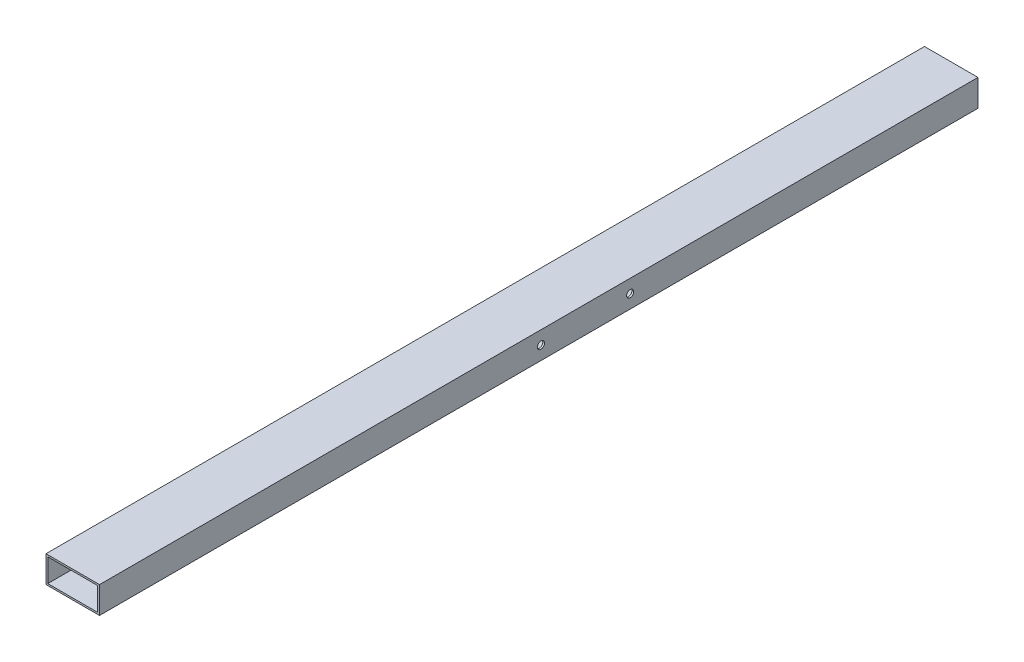
ISO-10303-21;
HEADER;
FILE_DESCRIPTION(('STEP AP214'),'2;1');
FILE_NAME('part.step','',(''),(''),'','','');
FILE_SCHEMA(('AUTOMOTIVE_DESIGN { 1 0 10303 214 1 1 1 1 }'));
ENDSEC;
DATA;
#1=APPLICATION_CONTEXT('core data for automotive mechanical design processes');
#2=APPLICATION_PROTOCOL_DEFINITION('international standard','automotive_design',2000,#1);
#3=PRODUCT_CONTEXT('',#1,'mechanical');
#4=PRODUCT('Part','Part','',(#3));
#5=PRODUCT_RELATED_PRODUCT_CATEGORY('part','',(#4));
#6=PRODUCT_DEFINITION_FORMATION('','',#4);
#7=PRODUCT_DEFINITION_CONTEXT('part definition',#1,'design');
#8=PRODUCT_DEFINITION('design','',#6,#7);
#9=PRODUCT_DEFINITION_SHAPE('','',#8);
#10=(LENGTH_UNIT() NAMED_UNIT(*) SI_UNIT(.MILLI.,.METRE.));
#11=(NAMED_UNIT(*) PLANE_ANGLE_UNIT() SI_UNIT($,.RADIAN.));
#12=(NAMED_UNIT(*) SI_UNIT($,.STERADIAN.) SOLID_ANGLE_UNIT());
#13=UNCERTAINTY_MEASURE_WITH_UNIT(LENGTH_MEASURE(1.E-05),#10,'distance_accuracy_value','');
#14=(GEOMETRIC_REPRESENTATION_CONTEXT(3) GLOBAL_UNCERTAINTY_ASSIGNED_CONTEXT((#13)) GLOBAL_UNIT_ASSIGNED_CONTEXT((#10,
#11,#12)) REPRESENTATION_CONTEXT('',''));
#15=CARTESIAN_POINT('',(0.,0.,0.));
#16=DIRECTION('',(0.,0.,1.));
#17=DIRECTION('',(1.,0.,0.));
#18=AXIS2_PLACEMENT_3D('',#15,#16,#17);
#19=CARTESIAN_POINT('',(0.,0.,985.));
#20=DIRECTION('',(0.,0.,-1.));
#21=DIRECTION('',(-1.,0.,0.));
#22=AXIS2_PLACEMENT_3D('',#19,#20,#21);
#23=PLANE('',#22);
#24=DIRECTION('',(0.,1.,0.));
#25=VECTOR('',#24,1.);
#26=CARTESIAN_POINT('',(30.,-15.,985.));
#27=LINE('',#26,#25);
#28=CARTESIAN_POINT('',(30.,-15.,985.));
#29=VERTEX_POINT('',#28);
#30=CARTESIAN_POINT('',(30.,15.,985.));
#31=VERTEX_POINT('',#30);
#32=EDGE_CURVE('E163',#29,#31,#27,.T.);
#33=ORIENTED_EDGE('',*,*,#32,.T.);
#34=DIRECTION('',(-1.,0.,0.));
#35=VECTOR('',#34,1.);
#36=CARTESIAN_POINT('',(-30.,15.,985.));
#37=LINE('',#36,#35);
#38=CARTESIAN_POINT('',(-30.,15.,985.));
#39=VERTEX_POINT('',#38);
#40=EDGE_CURVE('E167',#31,#39,#37,.T.);
#41=ORIENTED_EDGE('',*,*,#40,.T.);
#42=DIRECTION('',(0.,-1.,0.));
#43=VECTOR('',#42,1.);
#44=CARTESIAN_POINT('',(-30.,-15.,985.));
#45=LINE('',#44,#43);
#46=CARTESIAN_POINT('',(-30.,-15.,985.));
#47=VERTEX_POINT('',#46);
#48=EDGE_CURVE('E171',#39,#47,#45,.T.);
#49=ORIENTED_EDGE('',*,*,#48,.T.);
#50=DIRECTION('',(1.,0.,0.));
#51=VECTOR('',#50,1.);
#52=CARTESIAN_POINT('',(-30.,-15.,985.));
#53=LINE('',#52,#51);
#54=EDGE_CURVE('E174',#47,#29,#53,.T.);
#55=ORIENTED_EDGE('',*,*,#54,.T.);
#56=EDGE_LOOP('',(#33,#41,#49,#55));
#57=FACE_BOUND('',#56,.T.);
#58=DIRECTION('',(0.,1.,0.));
#59=VECTOR('',#58,1.);
#60=CARTESIAN_POINT('',(28.,-13.,985.));
#61=LINE('',#60,#59);
#62=CARTESIAN_POINT('',(28.,-13.,985.));
#63=VERTEX_POINT('',#62);
#64=CARTESIAN_POINT('',(28.,13.,985.));
#65=VERTEX_POINT('',#64);
#66=EDGE_CURVE('E113',#63,#65,#61,.T.);
#67=ORIENTED_EDGE('',*,*,#66,.F.);
#68=DIRECTION('',(1.,0.,0.));
#69=VECTOR('',#68,1.);
#70=CARTESIAN_POINT('',(-28.,-13.,985.));
#71=LINE('',#70,#69);
#72=CARTESIAN_POINT('',(-28.,-13.,985.));
#73=VERTEX_POINT('',#72);
#74=EDGE_CURVE('E139',#73,#63,#71,.T.);
#75=ORIENTED_EDGE('',*,*,#74,.F.);
#76=DIRECTION('',(0.,-1.,0.));
#77=VECTOR('',#76,1.);
#78=CARTESIAN_POINT('',(-28.,-13.,985.));
#79=LINE('',#78,#77);
#80=CARTESIAN_POINT('',(-28.,13.,985.));
#81=VERTEX_POINT('',#80);
#82=EDGE_CURVE('E135',#81,#73,#79,.T.);
#83=ORIENTED_EDGE('',*,*,#82,.F.);
#84=DIRECTION('',(-1.,0.,0.));
#85=VECTOR('',#84,1.);
#86=CARTESIAN_POINT('',(-28.,13.,985.));
#87=LINE('',#86,#85);
#88=EDGE_CURVE('E122',#65,#81,#87,.T.);
#89=ORIENTED_EDGE('',*,*,#88,.F.);
#90=EDGE_LOOP('',(#67,#75,#83,#89));
#91=FACE_BOUND('',#90,.T.);
#92=ADVANCED_FACE('F45',(#57,#91),#23,.F.);
#93=CARTESIAN_POINT('',(0.,0.,0.));
#94=DIRECTION('',(0.,0.,-1.));
#95=DIRECTION('',(-1.,0.,0.));
#96=AXIS2_PLACEMENT_3D('',#93,#94,#95);
#97=PLANE('',#96);
#98=DIRECTION('',(0.,1.,0.));
#99=VECTOR('',#98,1.);
#100=CARTESIAN_POINT('',(30.,-15.,0.));
#101=LINE('',#100,#99);
#102=CARTESIAN_POINT('',(30.,-15.,0.));
#103=VERTEX_POINT('',#102);
#104=CARTESIAN_POINT('',(30.,15.,0.));
#105=VERTEX_POINT('',#104);
#106=EDGE_CURVE('E131',#103,#105,#101,.T.);
#107=ORIENTED_EDGE('',*,*,#106,.F.);
#108=DIRECTION('',(1.,0.,0.));
#109=VECTOR('',#108,1.);
#110=CARTESIAN_POINT('',(-30.,-15.,0.));
#111=LINE('',#110,#109);
#112=CARTESIAN_POINT('',(-30.,-15.,0.));
#113=VERTEX_POINT('',#112);
#114=EDGE_CURVE('E168',#113,#103,#111,.T.);
#115=ORIENTED_EDGE('',*,*,#114,.F.);
#116=DIRECTION('',(0.,-1.,0.));
#117=VECTOR('',#116,1.);
#118=CARTESIAN_POINT('',(-30.,-15.,0.));
#119=LINE('',#118,#117);
#120=CARTESIAN_POINT('',(-30.,15.,0.));
#121=VERTEX_POINT('',#120);
#122=EDGE_CURVE('E184',#121,#113,#119,.T.);
#123=ORIENTED_EDGE('',*,*,#122,.F.);
#124=DIRECTION('',(-1.,0.,0.));
#125=VECTOR('',#124,1.);
#126=CARTESIAN_POINT('',(-30.,15.,0.));
#127=LINE('',#126,#125);
#128=EDGE_CURVE('E181',#105,#121,#127,.T.);
#129=ORIENTED_EDGE('',*,*,#128,.F.);
#130=EDGE_LOOP('',(#107,#115,#123,#129));
#131=FACE_BOUND('',#130,.T.);
#132=DIRECTION('',(1.,0.,0.));
#133=VECTOR('',#132,1.);
#134=CARTESIAN_POINT('',(-28.,-13.,0.));
#135=LINE('',#134,#133);
#136=CARTESIAN_POINT('',(-28.,-13.,0.));
#137=VERTEX_POINT('',#136);
#138=CARTESIAN_POINT('',(28.,-13.,0.));
#139=VERTEX_POINT('',#138);
#140=EDGE_CURVE('E123',#137,#139,#135,.T.);
#141=ORIENTED_EDGE('',*,*,#140,.T.);
#142=DIRECTION('',(0.,1.,0.));
#143=VECTOR('',#142,1.);
#144=CARTESIAN_POINT('',(28.,-13.,0.));
#145=LINE('',#144,#143);
#146=CARTESIAN_POINT('',(28.,13.,0.));
#147=VERTEX_POINT('',#146);
#148=EDGE_CURVE('E71',#139,#147,#145,.T.);
#149=ORIENTED_EDGE('',*,*,#148,.T.);
#150=DIRECTION('',(-1.,0.,0.));
#151=VECTOR('',#150,1.);
#152=CARTESIAN_POINT('',(-28.,13.,0.));
#153=LINE('',#152,#151);
#154=CARTESIAN_POINT('',(-28.,13.,0.));
#155=VERTEX_POINT('',#154);
#156=EDGE_CURVE('E129',#147,#155,#153,.T.);
#157=ORIENTED_EDGE('',*,*,#156,.T.);
#158=DIRECTION('',(0.,-1.,0.));
#159=VECTOR('',#158,1.);
#160=CARTESIAN_POINT('',(-28.,-13.,0.));
#161=LINE('',#160,#159);
#162=EDGE_CURVE('E150',#155,#137,#161,.T.);
#163=ORIENTED_EDGE('',*,*,#162,.T.);
#164=EDGE_LOOP('',(#141,#149,#157,#163));
#165=FACE_BOUND('',#164,.T.);
#166=ADVANCED_FACE('F244',(#131,#165),#97,.T.);
#167=CARTESIAN_POINT('',(30.,-15.,985.));
#168=DIRECTION('',(-1.,0.,0.));
#169=DIRECTION('',(0.,0.,1.));
#170=AXIS2_PLACEMENT_3D('',#167,#168,#169);
#171=PLANE('',#170);
#172=CARTESIAN_POINT('',(30.,0.,390.));
#173=DIRECTION('',(1.,0.,0.));
#174=DIRECTION('',(0.,0.,-1.));
#175=AXIS2_PLACEMENT_3D('',#172,#173,#174);
#176=CIRCLE('',#175,3.99999999999999);
#177=CARTESIAN_POINT('',(30.,0.,386.));
#178=VERTEX_POINT('',#177);
#179=EDGE_CURVE('E210',#178,#178,#176,.T.);
#180=ORIENTED_EDGE('',*,*,#179,.F.);
#181=EDGE_LOOP('',(#180));
#182=FACE_BOUND('',#181,.T.);
#183=CARTESIAN_POINT('',(30.,0.,490.));
#184=DIRECTION('',(1.,0.,0.));
#185=DIRECTION('',(0.,0.,-1.));
#186=AXIS2_PLACEMENT_3D('',#183,#184,#185);
#187=CIRCLE('',#186,3.99999999999999);
#188=CARTESIAN_POINT('',(30.,0.,486.));
#189=VERTEX_POINT('',#188);
#190=EDGE_CURVE('E216',#189,#189,#187,.T.);
#191=ORIENTED_EDGE('',*,*,#190,.F.);
#192=EDGE_LOOP('',(#191));
#193=FACE_BOUND('',#192,.T.);
#194=ORIENTED_EDGE('',*,*,#106,.T.);
#195=DIRECTION('',(0.,0.,-1.));
#196=VECTOR('',#195,1.);
#197=CARTESIAN_POINT('',(30.,15.,985.));
#198=LINE('',#197,#196);
#199=EDGE_CURVE('E11',#31,#105,#198,.T.);
#200=ORIENTED_EDGE('',*,*,#199,.F.);
#201=ORIENTED_EDGE('',*,*,#32,.F.);
#202=DIRECTION('',(0.,0.,-1.));
#203=VECTOR('',#202,1.);
#204=CARTESIAN_POINT('',(30.,-15.,985.));
#205=LINE('',#204,#203);
#206=EDGE_CURVE('E177',#29,#103,#205,.T.);
#207=ORIENTED_EDGE('',*,*,#206,.T.);
#208=EDGE_LOOP('',(#194,#200,#201,#207));
#209=FACE_BOUND('',#208,.T.);
#210=ADVANCED_FACE('F47',(#182,#193,#209),#171,.F.);
#211=CARTESIAN_POINT('',(-30.,15.,985.));
#212=DIRECTION('',(0.,-1.,0.));
#213=DIRECTION('',(0.,0.,-1.));
#214=AXIS2_PLACEMENT_3D('',#211,#212,#213);
#215=PLANE('',#214);
#216=ORIENTED_EDGE('',*,*,#128,.T.);
#217=DIRECTION('',(0.,0.,-1.));
#218=VECTOR('',#217,1.);
#219=CARTESIAN_POINT('',(-30.,15.,985.));
#220=LINE('',#219,#218);
#221=EDGE_CURVE('E55',#39,#121,#220,.T.);
#222=ORIENTED_EDGE('',*,*,#221,.F.);
#223=ORIENTED_EDGE('',*,*,#40,.F.);
#224=ORIENTED_EDGE('',*,*,#199,.T.);
#225=EDGE_LOOP('',(#216,#222,#223,#224));
#226=FACE_BOUND('',#225,.T.);
#227=ADVANCED_FACE('F272',(#226),#215,.F.);
#228=CARTESIAN_POINT('',(-30.,-15.,985.));
#229=DIRECTION('',(1.,0.,0.));
#230=DIRECTION('',(0.,0.,-1.));
#231=AXIS2_PLACEMENT_3D('',#228,#229,#230);
#232=PLANE('',#231);
#233=CARTESIAN_POINT('',(-30.,0.,390.));
#234=DIRECTION('',(1.,0.,0.));
#235=DIRECTION('',(0.,0.,-1.));
#236=AXIS2_PLACEMENT_3D('',#233,#234,#235);
#237=CIRCLE('',#236,3.99999999999999);
#238=CARTESIAN_POINT('',(-30.,0.,386.));
#239=VERTEX_POINT('',#238);
#240=EDGE_CURVE('E202',#239,#239,#237,.T.);
#241=ORIENTED_EDGE('',*,*,#240,.T.);
#242=EDGE_LOOP('',(#241));
#243=FACE_BOUND('',#242,.T.);
#244=CARTESIAN_POINT('',(-30.,0.,490.));
#245=DIRECTION('',(1.,0.,0.));
#246=DIRECTION('',(0.,0.,-1.));
#247=AXIS2_PLACEMENT_3D('',#244,#245,#246);
#248=CIRCLE('',#247,3.99999999999999);
#249=CARTESIAN_POINT('',(-30.,0.,486.));
#250=VERTEX_POINT('',#249);
#251=EDGE_CURVE('E222',#250,#250,#248,.T.);
#252=ORIENTED_EDGE('',*,*,#251,.T.);
#253=EDGE_LOOP('',(#252));
#254=FACE_BOUND('',#253,.T.);
#255=ORIENTED_EDGE('',*,*,#122,.T.);
#256=DIRECTION('',(0.,0.,-1.));
#257=VECTOR('',#256,1.);
#258=CARTESIAN_POINT('',(-30.,-15.,985.));
#259=LINE('',#258,#257);
#260=EDGE_CURVE('E192',#47,#113,#259,.T.);
#261=ORIENTED_EDGE('',*,*,#260,.F.);
#262=ORIENTED_EDGE('',*,*,#48,.F.);
#263=ORIENTED_EDGE('',*,*,#221,.T.);
#264=EDGE_LOOP('',(#255,#261,#262,#263));
#265=FACE_BOUND('',#264,.T.);
#266=ADVANCED_FACE('F269',(#243,#254,#265),#232,.F.);
#267=CARTESIAN_POINT('',(-30.,-15.,985.));
#268=DIRECTION('',(0.,1.,0.));
#269=DIRECTION('',(0.,0.,1.));
#270=AXIS2_PLACEMENT_3D('',#267,#268,#269);
#271=PLANE('',#270);
#272=ORIENTED_EDGE('',*,*,#114,.T.);
#273=ORIENTED_EDGE('',*,*,#206,.F.);
#274=ORIENTED_EDGE('',*,*,#54,.F.);
#275=ORIENTED_EDGE('',*,*,#260,.T.);
#276=EDGE_LOOP('',(#272,#273,#274,#275));
#277=FACE_BOUND('',#276,.T.);
#278=ADVANCED_FACE('F266',(#277),#271,.F.);
#279=CARTESIAN_POINT('',(28.,-13.,985.));
#280=DIRECTION('',(-1.,0.,0.));
#281=DIRECTION('',(0.,0.,1.));
#282=AXIS2_PLACEMENT_3D('',#279,#280,#281);
#283=PLANE('',#282);
#284=CARTESIAN_POINT('',(28.,0.,390.));
#285=DIRECTION('',(-1.,0.,0.));
#286=DIRECTION('',(0.,0.,1.));
#287=AXIS2_PLACEMENT_3D('',#284,#285,#286);
#288=CIRCLE('',#287,3.99999999999999);
#289=CARTESIAN_POINT('',(28.,0.,394.));
#290=VERTEX_POINT('',#289);
#291=EDGE_CURVE('E147',#290,#290,#288,.T.);
#292=ORIENTED_EDGE('',*,*,#291,.F.);
#293=EDGE_LOOP('',(#292));
#294=FACE_BOUND('',#293,.T.);
#295=CARTESIAN_POINT('',(28.,0.,490.));
#296=DIRECTION('',(-1.,0.,0.));
#297=DIRECTION('',(0.,0.,1.));
#298=AXIS2_PLACEMENT_3D('',#295,#296,#297);
#299=CIRCLE('',#298,3.99999999999999);
#300=CARTESIAN_POINT('',(28.,0.,494.));
#301=VERTEX_POINT('',#300);
#302=EDGE_CURVE('E201',#301,#301,#299,.T.);
#303=ORIENTED_EDGE('',*,*,#302,.F.);
#304=EDGE_LOOP('',(#303));
#305=FACE_BOUND('',#304,.T.);
#306=ORIENTED_EDGE('',*,*,#148,.F.);
#307=DIRECTION('',(0.,0.,-1.));
#308=VECTOR('',#307,1.);
#309=CARTESIAN_POINT('',(28.,-13.,985.));
#310=LINE('',#309,#308);
#311=EDGE_CURVE('E117',#63,#139,#310,.T.);
#312=ORIENTED_EDGE('',*,*,#311,.F.);
#313=ORIENTED_EDGE('',*,*,#66,.T.);
#314=DIRECTION('',(0.,0.,-1.));
#315=VECTOR('',#314,1.);
#316=CARTESIAN_POINT('',(28.,13.,985.));
#317=LINE('',#316,#315);
#318=EDGE_CURVE('E116',#65,#147,#317,.T.);
#319=ORIENTED_EDGE('',*,*,#318,.T.);
#320=EDGE_LOOP('',(#306,#312,#313,#319));
#321=FACE_BOUND('',#320,.T.);
#322=ADVANCED_FACE('F115',(#294,#305,#321),#283,.T.);
#323=CARTESIAN_POINT('',(-28.,13.,985.));
#324=DIRECTION('',(0.,-1.,0.));
#325=DIRECTION('',(0.,0.,-1.));
#326=AXIS2_PLACEMENT_3D('',#323,#324,#325);
#327=PLANE('',#326);
#328=ORIENTED_EDGE('',*,*,#156,.F.);
#329=ORIENTED_EDGE('',*,*,#318,.F.);
#330=ORIENTED_EDGE('',*,*,#88,.T.);
#331=DIRECTION('',(0.,0.,-1.));
#332=VECTOR('',#331,1.);
#333=CARTESIAN_POINT('',(-28.,13.,985.));
#334=LINE('',#333,#332);
#335=EDGE_CURVE('E132',#81,#155,#334,.T.);
#336=ORIENTED_EDGE('',*,*,#335,.T.);
#337=EDGE_LOOP('',(#328,#329,#330,#336));
#338=FACE_BOUND('',#337,.T.);
#339=ADVANCED_FACE('F126',(#338),#327,.T.);
#340=CARTESIAN_POINT('',(-28.,-13.,985.));
#341=DIRECTION('',(1.,0.,0.));
#342=DIRECTION('',(0.,0.,-1.));
#343=AXIS2_PLACEMENT_3D('',#340,#341,#342);
#344=PLANE('',#343);
#345=CARTESIAN_POINT('',(-28.,0.,390.));
#346=DIRECTION('',(1.,0.,0.));
#347=DIRECTION('',(0.,0.,-1.));
#348=AXIS2_PLACEMENT_3D('',#345,#346,#347);
#349=CIRCLE('',#348,3.99999999999999);
#350=CARTESIAN_POINT('',(-28.,0.,386.));
#351=VERTEX_POINT('',#350);
#352=EDGE_CURVE('E49',#351,#351,#349,.T.);
#353=ORIENTED_EDGE('',*,*,#352,.F.);
#354=EDGE_LOOP('',(#353));
#355=FACE_BOUND('',#354,.T.);
#356=CARTESIAN_POINT('',(-28.,0.,490.));
#357=DIRECTION('',(1.,0.,0.));
#358=DIRECTION('',(0.,0.,-1.));
#359=AXIS2_PLACEMENT_3D('',#356,#357,#358);
#360=CIRCLE('',#359,3.99999999999999);
#361=CARTESIAN_POINT('',(-28.,0.,486.));
#362=VERTEX_POINT('',#361);
#363=EDGE_CURVE('E198',#362,#362,#360,.T.);
#364=ORIENTED_EDGE('',*,*,#363,.F.);
#365=EDGE_LOOP('',(#364));
#366=FACE_BOUND('',#365,.T.);
#367=ORIENTED_EDGE('',*,*,#162,.F.);
#368=ORIENTED_EDGE('',*,*,#335,.F.);
#369=ORIENTED_EDGE('',*,*,#82,.T.);
#370=DIRECTION('',(0.,0.,-1.));
#371=VECTOR('',#370,1.);
#372=CARTESIAN_POINT('',(-28.,-13.,985.));
#373=LINE('',#372,#371);
#374=EDGE_CURVE('E63',#73,#137,#373,.T.);
#375=ORIENTED_EDGE('',*,*,#374,.T.);
#376=EDGE_LOOP('',(#367,#368,#369,#375));
#377=FACE_BOUND('',#376,.T.);
#378=ADVANCED_FACE('F236',(#355,#366,#377),#344,.T.);
#379=CARTESIAN_POINT('',(-28.,-13.,985.));
#380=DIRECTION('',(0.,1.,0.));
#381=DIRECTION('',(0.,0.,1.));
#382=AXIS2_PLACEMENT_3D('',#379,#380,#381);
#383=PLANE('',#382);
#384=ORIENTED_EDGE('',*,*,#140,.F.);
#385=ORIENTED_EDGE('',*,*,#374,.F.);
#386=ORIENTED_EDGE('',*,*,#74,.T.);
#387=ORIENTED_EDGE('',*,*,#311,.T.);
#388=EDGE_LOOP('',(#384,#385,#386,#387));
#389=FACE_BOUND('',#388,.T.);
#390=ADVANCED_FACE('F239',(#389),#383,.T.);
#391=CARTESIAN_POINT('',(-30.,0.,490.));
#392=DIRECTION('',(1.,0.,0.));
#393=DIRECTION('',(0.,0.,-1.));
#394=AXIS2_PLACEMENT_3D('',#391,#392,#393);
#395=CYLINDRICAL_SURFACE('',#394,3.99999999999999);
#396=ORIENTED_EDGE('',*,*,#363,.T.);
#397=EDGE_LOOP('',(#396));
#398=FACE_BOUND('',#397,.T.);
#399=ORIENTED_EDGE('',*,*,#251,.F.);
#400=EDGE_LOOP('',(#399));
#401=FACE_BOUND('',#400,.T.);
#402=ADVANCED_FACE('F246',(#398,#401),#395,.F.);
#403=CARTESIAN_POINT('',(-30.,0.,390.));
#404=DIRECTION('',(1.,0.,0.));
#405=DIRECTION('',(0.,0.,-1.));
#406=AXIS2_PLACEMENT_3D('',#403,#404,#405);
#407=CYLINDRICAL_SURFACE('',#406,3.99999999999999);
#408=ORIENTED_EDGE('',*,*,#352,.T.);
#409=EDGE_LOOP('',(#408));
#410=FACE_BOUND('',#409,.T.);
#411=ORIENTED_EDGE('',*,*,#240,.F.);
#412=EDGE_LOOP('',(#411));
#413=FACE_BOUND('',#412,.T.);
#414=ADVANCED_FACE('F233',(#410,#413),#407,.F.);
#415=ORIENTED_EDGE('',*,*,#302,.T.);
#416=EDGE_LOOP('',(#415));
#417=FACE_BOUND('',#416,.T.);
#418=ORIENTED_EDGE('',*,*,#190,.T.);
#419=EDGE_LOOP('',(#418));
#420=FACE_BOUND('',#419,.T.);
#421=ADVANCED_FACE('F254',(#417,#420),#395,.F.);
#422=ORIENTED_EDGE('',*,*,#291,.T.);
#423=EDGE_LOOP('',(#422));
#424=FACE_BOUND('',#423,.T.);
#425=ORIENTED_EDGE('',*,*,#179,.T.);
#426=EDGE_LOOP('',(#425));
#427=FACE_BOUND('',#426,.T.);
#428=ADVANCED_FACE('F297',(#424,#427),#407,.F.);
#429=CLOSED_SHELL('',(#92,#166,#210,#227,#266,#278,#322,#339,#378,#390,#402,#414,#421,#428));
#430=MANIFOLD_SOLID_BREP('B2',#429);
#431=ADVANCED_BREP_SHAPE_REPRESENTATION('',(#18,#430),#14);
#432=SHAPE_DEFINITION_REPRESENTATION(#9,#431);
ENDSEC;
END-ISO-10303-21;
